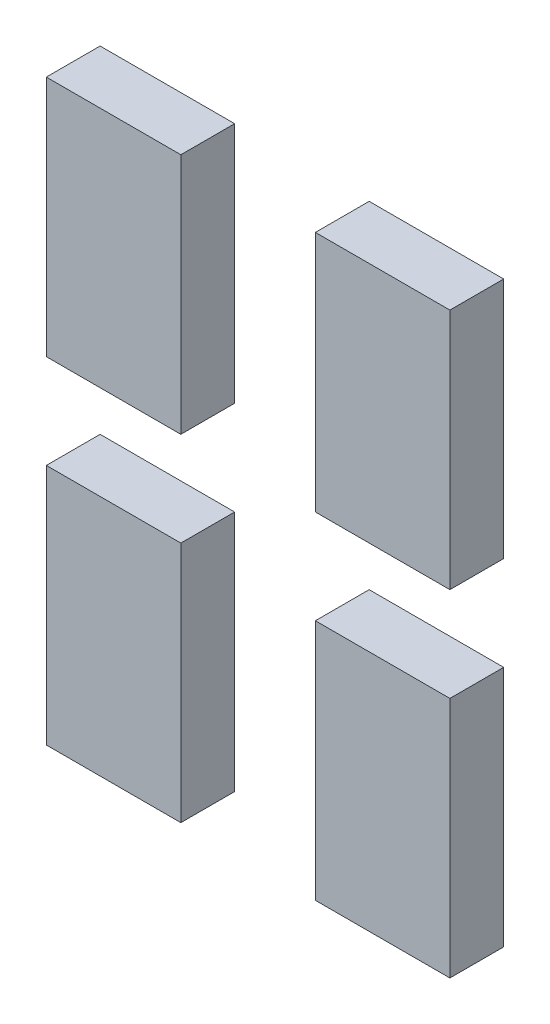
ISO-10303-21;
HEADER;
FILE_DESCRIPTION(('STEP AP214'),'2;1');
FILE_NAME('part.step','',(''),(''),'','','');
FILE_SCHEMA(('AUTOMOTIVE_DESIGN { 1 0 10303 214 1 1 1 1 }'));
ENDSEC;
DATA;
#1=APPLICATION_CONTEXT('core data for automotive mechanical design processes');
#2=APPLICATION_PROTOCOL_DEFINITION('international standard','automotive_design',2000,#1);
#3=PRODUCT_CONTEXT('',#1,'mechanical');
#4=PRODUCT('Part','Part','',(#3));
#5=PRODUCT_RELATED_PRODUCT_CATEGORY('part','',(#4));
#6=PRODUCT_DEFINITION_FORMATION('','',#4);
#7=PRODUCT_DEFINITION_CONTEXT('part definition',#1,'design');
#8=PRODUCT_DEFINITION('design','',#6,#7);
#9=PRODUCT_DEFINITION_SHAPE('','',#8);
#10=(LENGTH_UNIT() NAMED_UNIT(*) SI_UNIT(.MILLI.,.METRE.));
#11=(NAMED_UNIT(*) PLANE_ANGLE_UNIT() SI_UNIT($,.RADIAN.));
#12=(NAMED_UNIT(*) SI_UNIT($,.STERADIAN.) SOLID_ANGLE_UNIT());
#13=UNCERTAINTY_MEASURE_WITH_UNIT(LENGTH_MEASURE(1.E-05),#10,'distance_accuracy_value','');
#14=(GEOMETRIC_REPRESENTATION_CONTEXT(3) GLOBAL_UNCERTAINTY_ASSIGNED_CONTEXT((#13)) GLOBAL_UNIT_ASSIGNED_CONTEXT((#10,
#11,#12)) REPRESENTATION_CONTEXT('',''));
#15=CARTESIAN_POINT('',(0.,0.,0.));
#16=DIRECTION('',(0.,0.,1.));
#17=DIRECTION('',(1.,0.,0.));
#18=AXIS2_PLACEMENT_3D('',#15,#16,#17);
#19=CARTESIAN_POINT('',(-1.00000000000002,6.8,0.8));
#20=DIRECTION('',(0.,-1.,0.));
#21=DIRECTION('',(0.,0.,-1.));
#22=AXIS2_PLACEMENT_3D('',#19,#20,#21);
#23=PLANE('',#22);
#24=DIRECTION('',(-1.,0.,0.));
#25=VECTOR('',#24,1.);
#26=CARTESIAN_POINT('',(-1.00000000000002,6.8,0.));
#27=LINE('',#26,#25);
#28=CARTESIAN_POINT('',(0.999999999999983,6.8,0.));
#29=VERTEX_POINT('',#28);
#30=CARTESIAN_POINT('',(-1.00000000000002,6.8,0.));
#31=VERTEX_POINT('',#30);
#32=EDGE_CURVE('E110',#29,#31,#27,.T.);
#33=ORIENTED_EDGE('',*,*,#32,.T.);
#34=DIRECTION('',(0.,0.,-1.));
#35=VECTOR('',#34,1.);
#36=CARTESIAN_POINT('',(-1.00000000000002,6.8,0.8));
#37=LINE('',#36,#35);
#38=CARTESIAN_POINT('',(-1.00000000000002,6.8,0.8));
#39=VERTEX_POINT('',#38);
#40=EDGE_CURVE('E12',#39,#31,#37,.T.);
#41=ORIENTED_EDGE('',*,*,#40,.F.);
#42=DIRECTION('',(-1.,0.,0.));
#43=VECTOR('',#42,1.);
#44=CARTESIAN_POINT('',(-1.00000000000002,6.8,0.8));
#45=LINE('',#44,#43);
#46=CARTESIAN_POINT('',(0.999999999999983,6.8,0.8));
#47=VERTEX_POINT('',#46);
#48=EDGE_CURVE('E98',#47,#39,#45,.T.);
#49=ORIENTED_EDGE('',*,*,#48,.F.);
#50=DIRECTION('',(0.,0.,-1.));
#51=VECTOR('',#50,1.);
#52=CARTESIAN_POINT('',(0.999999999999983,6.8,0.8));
#53=LINE('',#52,#51);
#54=EDGE_CURVE('E106',#47,#29,#53,.T.);
#55=ORIENTED_EDGE('',*,*,#54,.T.);
#56=EDGE_LOOP('',(#33,#41,#49,#55));
#57=FACE_BOUND('',#56,.T.);
#58=ADVANCED_FACE('F47',(#57),#23,.F.);
#59=CARTESIAN_POINT('',(-1.00000000000002,3.2,0.8));
#60=DIRECTION('',(1.,0.,0.));
#61=DIRECTION('',(0.,0.,-1.));
#62=AXIS2_PLACEMENT_3D('',#59,#60,#61);
#63=PLANE('',#62);
#64=DIRECTION('',(0.,-1.,0.));
#65=VECTOR('',#64,1.);
#66=CARTESIAN_POINT('',(-1.00000000000002,3.2,0.));
#67=LINE('',#66,#65);
#68=CARTESIAN_POINT('',(-1.00000000000002,3.2,0.));
#69=VERTEX_POINT('',#68);
#70=EDGE_CURVE('E102',#31,#69,#67,.T.);
#71=ORIENTED_EDGE('',*,*,#70,.T.);
#72=DIRECTION('',(0.,0.,-1.));
#73=VECTOR('',#72,1.);
#74=CARTESIAN_POINT('',(-1.00000000000002,3.2,0.8));
#75=LINE('',#74,#73);
#76=CARTESIAN_POINT('',(-1.00000000000002,3.2,0.8));
#77=VERTEX_POINT('',#76);
#78=EDGE_CURVE('E55',#77,#69,#75,.T.);
#79=ORIENTED_EDGE('',*,*,#78,.F.);
#80=DIRECTION('',(0.,-1.,0.));
#81=VECTOR('',#80,1.);
#82=CARTESIAN_POINT('',(-1.00000000000002,3.2,0.8));
#83=LINE('',#82,#81);
#84=EDGE_CURVE('E93',#39,#77,#83,.T.);
#85=ORIENTED_EDGE('',*,*,#84,.F.);
#86=ORIENTED_EDGE('',*,*,#40,.T.);
#87=EDGE_LOOP('',(#71,#79,#85,#86));
#88=FACE_BOUND('',#87,.T.);
#89=ADVANCED_FACE('F101',(#88),#63,.F.);
#90=CARTESIAN_POINT('',(-1.00000000000002,3.2,0.8));
#91=DIRECTION('',(0.,1.,0.));
#92=DIRECTION('',(0.,0.,1.));
#93=AXIS2_PLACEMENT_3D('',#90,#91,#92);
#94=PLANE('',#93);
#95=DIRECTION('',(1.,0.,0.));
#96=VECTOR('',#95,1.);
#97=CARTESIAN_POINT('',(-1.00000000000002,3.2,0.));
#98=LINE('',#97,#96);
#99=CARTESIAN_POINT('',(0.999999999999983,3.2,0.));
#100=VERTEX_POINT('',#99);
#101=EDGE_CURVE('E80',#69,#100,#98,.T.);
#102=ORIENTED_EDGE('',*,*,#101,.T.);
#103=DIRECTION('',(0.,0.,-1.));
#104=VECTOR('',#103,1.);
#105=CARTESIAN_POINT('',(0.999999999999983,3.2,0.8));
#106=LINE('',#105,#104);
#107=CARTESIAN_POINT('',(0.999999999999983,3.2,0.8));
#108=VERTEX_POINT('',#107);
#109=EDGE_CURVE('E103',#108,#100,#106,.T.);
#110=ORIENTED_EDGE('',*,*,#109,.F.);
#111=DIRECTION('',(1.,0.,0.));
#112=VECTOR('',#111,1.);
#113=CARTESIAN_POINT('',(-1.00000000000002,3.2,0.8));
#114=LINE('',#113,#112);
#115=EDGE_CURVE('E96',#77,#108,#114,.T.);
#116=ORIENTED_EDGE('',*,*,#115,.F.);
#117=ORIENTED_EDGE('',*,*,#78,.T.);
#118=EDGE_LOOP('',(#102,#110,#116,#117));
#119=FACE_BOUND('',#118,.T.);
#120=ADVANCED_FACE('F104',(#119),#94,.F.);
#121=CARTESIAN_POINT('',(0.999999999999983,3.2,0.8));
#122=DIRECTION('',(-1.,0.,0.));
#123=DIRECTION('',(0.,0.,1.));
#124=AXIS2_PLACEMENT_3D('',#121,#122,#123);
#125=PLANE('',#124);
#126=DIRECTION('',(0.,1.,0.));
#127=VECTOR('',#126,1.);
#128=CARTESIAN_POINT('',(0.999999999999983,3.2,0.));
#129=LINE('',#128,#127);
#130=EDGE_CURVE('E86',#100,#29,#129,.T.);
#131=ORIENTED_EDGE('',*,*,#130,.T.);
#132=ORIENTED_EDGE('',*,*,#54,.F.);
#133=DIRECTION('',(0.,1.,0.));
#134=VECTOR('',#133,1.);
#135=CARTESIAN_POINT('',(0.999999999999983,3.2,0.8));
#136=LINE('',#135,#134);
#137=EDGE_CURVE('E63',#108,#47,#136,.T.);
#138=ORIENTED_EDGE('',*,*,#137,.F.);
#139=ORIENTED_EDGE('',*,*,#109,.T.);
#140=EDGE_LOOP('',(#131,#132,#138,#139));
#141=FACE_BOUND('',#140,.T.);
#142=ADVANCED_FACE('F117',(#141),#125,.F.);
#143=CARTESIAN_POINT('',(0.,0.,0.8));
#144=DIRECTION('',(0.,0.,1.));
#145=DIRECTION('',(1.,0.,0.));
#146=AXIS2_PLACEMENT_3D('',#143,#144,#145);
#147=PLANE('',#146);
#148=ORIENTED_EDGE('',*,*,#48,.T.);
#149=ORIENTED_EDGE('',*,*,#84,.T.);
#150=ORIENTED_EDGE('',*,*,#115,.T.);
#151=ORIENTED_EDGE('',*,*,#137,.T.);
#152=EDGE_LOOP('',(#148,#149,#150,#151));
#153=FACE_BOUND('',#152,.T.);
#154=ADVANCED_FACE('F94',(#153),#147,.T.);
#155=CARTESIAN_POINT('',(0.,0.,0.));
#156=DIRECTION('',(0.,0.,1.));
#157=DIRECTION('',(1.,0.,0.));
#158=AXIS2_PLACEMENT_3D('',#155,#156,#157);
#159=PLANE('',#158);
#160=ORIENTED_EDGE('',*,*,#32,.F.);
#161=ORIENTED_EDGE('',*,*,#130,.F.);
#162=ORIENTED_EDGE('',*,*,#101,.F.);
#163=ORIENTED_EDGE('',*,*,#70,.F.);
#164=EDGE_LOOP('',(#160,#161,#162,#163));
#165=FACE_BOUND('',#164,.T.);
#166=ADVANCED_FACE('F120',(#165),#159,.F.);
#167=CLOSED_SHELL('',(#58,#89,#120,#142,#154,#166));
#168=MANIFOLD_SOLID_BREP('B2',#167);
#169=CARTESIAN_POINT('',(2.99999999999998,6.8,0.8));
#170=DIRECTION('',(0.,-1.,0.));
#171=DIRECTION('',(0.,0.,-1.));
#172=AXIS2_PLACEMENT_3D('',#169,#170,#171);
#173=PLANE('',#172);
#174=DIRECTION('',(-1.,0.,0.));
#175=VECTOR('',#174,1.);
#176=CARTESIAN_POINT('',(2.99999999999998,6.8,0.));
#177=LINE('',#176,#175);
#178=CARTESIAN_POINT('',(4.99999999999998,6.8,0.));
#179=VERTEX_POINT('',#178);
#180=CARTESIAN_POINT('',(2.99999999999998,6.8,0.));
#181=VERTEX_POINT('',#180);
#182=EDGE_CURVE('E243',#179,#181,#177,.T.);
#183=ORIENTED_EDGE('',*,*,#182,.T.);
#184=DIRECTION('',(0.,0.,-1.));
#185=VECTOR('',#184,1.);
#186=CARTESIAN_POINT('',(2.99999999999998,6.8,0.8));
#187=LINE('',#186,#185);
#188=CARTESIAN_POINT('',(2.99999999999998,6.8,0.8));
#189=VERTEX_POINT('',#188);
#190=EDGE_CURVE('E45',#189,#181,#187,.T.);
#191=ORIENTED_EDGE('',*,*,#190,.F.);
#192=DIRECTION('',(-1.,0.,0.));
#193=VECTOR('',#192,1.);
#194=CARTESIAN_POINT('',(2.99999999999998,6.8,0.8));
#195=LINE('',#194,#193);
#196=CARTESIAN_POINT('',(4.99999999999998,6.8,0.8));
#197=VERTEX_POINT('',#196);
#198=EDGE_CURVE('E231',#197,#189,#195,.T.);
#199=ORIENTED_EDGE('',*,*,#198,.F.);
#200=DIRECTION('',(0.,0.,-1.));
#201=VECTOR('',#200,1.);
#202=CARTESIAN_POINT('',(4.99999999999998,6.8,0.8));
#203=LINE('',#202,#201);
#204=EDGE_CURVE('E239',#197,#179,#203,.T.);
#205=ORIENTED_EDGE('',*,*,#204,.T.);
#206=EDGE_LOOP('',(#183,#191,#199,#205));
#207=FACE_BOUND('',#206,.T.);
#208=ADVANCED_FACE('F180',(#207),#173,.F.);
#209=CARTESIAN_POINT('',(2.99999999999998,3.2,0.8));
#210=DIRECTION('',(1.,0.,0.));
#211=DIRECTION('',(0.,0.,-1.));
#212=AXIS2_PLACEMENT_3D('',#209,#210,#211);
#213=PLANE('',#212);
#214=DIRECTION('',(0.,-1.,0.));
#215=VECTOR('',#214,1.);
#216=CARTESIAN_POINT('',(2.99999999999998,3.2,0.));
#217=LINE('',#216,#215);
#218=CARTESIAN_POINT('',(2.99999999999998,3.2,0.));
#219=VERTEX_POINT('',#218);
#220=EDGE_CURVE('E235',#181,#219,#217,.T.);
#221=ORIENTED_EDGE('',*,*,#220,.T.);
#222=DIRECTION('',(0.,0.,-1.));
#223=VECTOR('',#222,1.);
#224=CARTESIAN_POINT('',(2.99999999999998,3.2,0.8));
#225=LINE('',#224,#223);
#226=CARTESIAN_POINT('',(2.99999999999998,3.2,0.8));
#227=VERTEX_POINT('',#226);
#228=EDGE_CURVE('E188',#227,#219,#225,.T.);
#229=ORIENTED_EDGE('',*,*,#228,.F.);
#230=DIRECTION('',(0.,-1.,0.));
#231=VECTOR('',#230,1.);
#232=CARTESIAN_POINT('',(2.99999999999998,3.2,0.8));
#233=LINE('',#232,#231);
#234=EDGE_CURVE('E226',#189,#227,#233,.T.);
#235=ORIENTED_EDGE('',*,*,#234,.F.);
#236=ORIENTED_EDGE('',*,*,#190,.T.);
#237=EDGE_LOOP('',(#221,#229,#235,#236));
#238=FACE_BOUND('',#237,.T.);
#239=ADVANCED_FACE('F234',(#238),#213,.F.);
#240=CARTESIAN_POINT('',(2.99999999999998,3.2,0.8));
#241=DIRECTION('',(0.,1.,0.));
#242=DIRECTION('',(0.,0.,1.));
#243=AXIS2_PLACEMENT_3D('',#240,#241,#242);
#244=PLANE('',#243);
#245=DIRECTION('',(1.,0.,0.));
#246=VECTOR('',#245,1.);
#247=CARTESIAN_POINT('',(2.99999999999998,3.2,0.));
#248=LINE('',#247,#246);
#249=CARTESIAN_POINT('',(4.99999999999998,3.2,0.));
#250=VERTEX_POINT('',#249);
#251=EDGE_CURVE('E213',#219,#250,#248,.T.);
#252=ORIENTED_EDGE('',*,*,#251,.T.);
#253=DIRECTION('',(0.,0.,-1.));
#254=VECTOR('',#253,1.);
#255=CARTESIAN_POINT('',(4.99999999999998,3.2,0.8));
#256=LINE('',#255,#254);
#257=CARTESIAN_POINT('',(4.99999999999998,3.2,0.8));
#258=VERTEX_POINT('',#257);
#259=EDGE_CURVE('E236',#258,#250,#256,.T.);
#260=ORIENTED_EDGE('',*,*,#259,.F.);
#261=DIRECTION('',(1.,0.,0.));
#262=VECTOR('',#261,1.);
#263=CARTESIAN_POINT('',(2.99999999999998,3.2,0.8));
#264=LINE('',#263,#262);
#265=EDGE_CURVE('E229',#227,#258,#264,.T.);
#266=ORIENTED_EDGE('',*,*,#265,.F.);
#267=ORIENTED_EDGE('',*,*,#228,.T.);
#268=EDGE_LOOP('',(#252,#260,#266,#267));
#269=FACE_BOUND('',#268,.T.);
#270=ADVANCED_FACE('F237',(#269),#244,.F.);
#271=CARTESIAN_POINT('',(4.99999999999998,3.2,0.8));
#272=DIRECTION('',(-1.,0.,0.));
#273=DIRECTION('',(0.,0.,1.));
#274=AXIS2_PLACEMENT_3D('',#271,#272,#273);
#275=PLANE('',#274);
#276=DIRECTION('',(0.,1.,0.));
#277=VECTOR('',#276,1.);
#278=CARTESIAN_POINT('',(4.99999999999998,3.2,0.));
#279=LINE('',#278,#277);
#280=EDGE_CURVE('E219',#250,#179,#279,.T.);
#281=ORIENTED_EDGE('',*,*,#280,.T.);
#282=ORIENTED_EDGE('',*,*,#204,.F.);
#283=DIRECTION('',(0.,1.,0.));
#284=VECTOR('',#283,1.);
#285=CARTESIAN_POINT('',(4.99999999999998,3.2,0.8));
#286=LINE('',#285,#284);
#287=EDGE_CURVE('E196',#258,#197,#286,.T.);
#288=ORIENTED_EDGE('',*,*,#287,.F.);
#289=ORIENTED_EDGE('',*,*,#259,.T.);
#290=EDGE_LOOP('',(#281,#282,#288,#289));
#291=FACE_BOUND('',#290,.T.);
#292=ADVANCED_FACE('F250',(#291),#275,.F.);
#293=CARTESIAN_POINT('',(0.,0.,0.8));
#294=DIRECTION('',(0.,0.,1.));
#295=DIRECTION('',(1.,0.,0.));
#296=AXIS2_PLACEMENT_3D('',#293,#294,#295);
#297=PLANE('',#296);
#298=ORIENTED_EDGE('',*,*,#198,.T.);
#299=ORIENTED_EDGE('',*,*,#234,.T.);
#300=ORIENTED_EDGE('',*,*,#265,.T.);
#301=ORIENTED_EDGE('',*,*,#287,.T.);
#302=EDGE_LOOP('',(#298,#299,#300,#301));
#303=FACE_BOUND('',#302,.T.);
#304=ADVANCED_FACE('F227',(#303),#297,.T.);
#305=CARTESIAN_POINT('',(0.,0.,0.));
#306=DIRECTION('',(0.,0.,1.));
#307=DIRECTION('',(1.,0.,0.));
#308=AXIS2_PLACEMENT_3D('',#305,#306,#307);
#309=PLANE('',#308);
#310=ORIENTED_EDGE('',*,*,#182,.F.);
#311=ORIENTED_EDGE('',*,*,#280,.F.);
#312=ORIENTED_EDGE('',*,*,#251,.F.);
#313=ORIENTED_EDGE('',*,*,#220,.F.);
#314=EDGE_LOOP('',(#310,#311,#312,#313));
#315=FACE_BOUND('',#314,.T.);
#316=ADVANCED_FACE('F253',(#315),#309,.F.);
#317=CLOSED_SHELL('',(#208,#239,#270,#292,#304,#316));
#318=MANIFOLD_SOLID_BREP('B6',#317);
#319=CARTESIAN_POINT('',(3.,1.8,0.8));
#320=DIRECTION('',(0.,-1.,0.));
#321=DIRECTION('',(0.,0.,-1.));
#322=AXIS2_PLACEMENT_3D('',#319,#320,#321);
#323=PLANE('',#322);
#324=DIRECTION('',(-1.,0.,0.));
#325=VECTOR('',#324,1.);
#326=CARTESIAN_POINT('',(3.,1.8,0.));
#327=LINE('',#326,#325);
#328=CARTESIAN_POINT('',(5.,1.8,0.));
#329=VERTEX_POINT('',#328);
#330=CARTESIAN_POINT('',(3.,1.8,0.));
#331=VERTEX_POINT('',#330);
#332=EDGE_CURVE('E375',#329,#331,#327,.T.);
#333=ORIENTED_EDGE('',*,*,#332,.T.);
#334=DIRECTION('',(0.,0.,-1.));
#335=VECTOR('',#334,1.);
#336=CARTESIAN_POINT('',(3.,1.8,0.8));
#337=LINE('',#336,#335);
#338=CARTESIAN_POINT('',(3.,1.8,0.8));
#339=VERTEX_POINT('',#338);
#340=EDGE_CURVE('E178',#339,#331,#337,.T.);
#341=ORIENTED_EDGE('',*,*,#340,.F.);
#342=DIRECTION('',(-1.,0.,0.));
#343=VECTOR('',#342,1.);
#344=CARTESIAN_POINT('',(3.,1.8,0.8));
#345=LINE('',#344,#343);
#346=CARTESIAN_POINT('',(5.,1.8,0.8));
#347=VERTEX_POINT('',#346);
#348=EDGE_CURVE('E363',#347,#339,#345,.T.);
#349=ORIENTED_EDGE('',*,*,#348,.F.);
#350=DIRECTION('',(0.,0.,-1.));
#351=VECTOR('',#350,1.);
#352=CARTESIAN_POINT('',(5.,1.8,0.8));
#353=LINE('',#352,#351);
#354=EDGE_CURVE('E371',#347,#329,#353,.T.);
#355=ORIENTED_EDGE('',*,*,#354,.T.);
#356=EDGE_LOOP('',(#333,#341,#349,#355));
#357=FACE_BOUND('',#356,.T.);
#358=ADVANCED_FACE('F312',(#357),#323,.F.);
#359=CARTESIAN_POINT('',(3.,-1.8,0.8));
#360=DIRECTION('',(1.,0.,0.));
#361=DIRECTION('',(0.,0.,-1.));
#362=AXIS2_PLACEMENT_3D('',#359,#360,#361);
#363=PLANE('',#362);
#364=DIRECTION('',(0.,-1.,0.));
#365=VECTOR('',#364,1.);
#366=CARTESIAN_POINT('',(3.,-1.8,0.));
#367=LINE('',#366,#365);
#368=CARTESIAN_POINT('',(3.,-1.8,0.));
#369=VERTEX_POINT('',#368);
#370=EDGE_CURVE('E367',#331,#369,#367,.T.);
#371=ORIENTED_EDGE('',*,*,#370,.T.);
#372=DIRECTION('',(0.,0.,-1.));
#373=VECTOR('',#372,1.);
#374=CARTESIAN_POINT('',(3.,-1.8,0.8));
#375=LINE('',#374,#373);
#376=CARTESIAN_POINT('',(3.,-1.8,0.8));
#377=VERTEX_POINT('',#376);
#378=EDGE_CURVE('E320',#377,#369,#375,.T.);
#379=ORIENTED_EDGE('',*,*,#378,.F.);
#380=DIRECTION('',(0.,-1.,0.));
#381=VECTOR('',#380,1.);
#382=CARTESIAN_POINT('',(3.,-1.8,0.8));
#383=LINE('',#382,#381);
#384=EDGE_CURVE('E358',#339,#377,#383,.T.);
#385=ORIENTED_EDGE('',*,*,#384,.F.);
#386=ORIENTED_EDGE('',*,*,#340,.T.);
#387=EDGE_LOOP('',(#371,#379,#385,#386));
#388=FACE_BOUND('',#387,.T.);
#389=ADVANCED_FACE('F366',(#388),#363,.F.);
#390=CARTESIAN_POINT('',(3.,-1.8,0.8));
#391=DIRECTION('',(0.,1.,0.));
#392=DIRECTION('',(0.,0.,1.));
#393=AXIS2_PLACEMENT_3D('',#390,#391,#392);
#394=PLANE('',#393);
#395=DIRECTION('',(1.,0.,0.));
#396=VECTOR('',#395,1.);
#397=CARTESIAN_POINT('',(3.,-1.8,0.));
#398=LINE('',#397,#396);
#399=CARTESIAN_POINT('',(5.,-1.8,0.));
#400=VERTEX_POINT('',#399);
#401=EDGE_CURVE('E345',#369,#400,#398,.T.);
#402=ORIENTED_EDGE('',*,*,#401,.T.);
#403=DIRECTION('',(0.,0.,-1.));
#404=VECTOR('',#403,1.);
#405=CARTESIAN_POINT('',(5.,-1.8,0.8));
#406=LINE('',#405,#404);
#407=CARTESIAN_POINT('',(5.,-1.8,0.8));
#408=VERTEX_POINT('',#407);
#409=EDGE_CURVE('E368',#408,#400,#406,.T.);
#410=ORIENTED_EDGE('',*,*,#409,.F.);
#411=DIRECTION('',(1.,0.,0.));
#412=VECTOR('',#411,1.);
#413=CARTESIAN_POINT('',(3.,-1.8,0.8));
#414=LINE('',#413,#412);
#415=EDGE_CURVE('E361',#377,#408,#414,.T.);
#416=ORIENTED_EDGE('',*,*,#415,.F.);
#417=ORIENTED_EDGE('',*,*,#378,.T.);
#418=EDGE_LOOP('',(#402,#410,#416,#417));
#419=FACE_BOUND('',#418,.T.);
#420=ADVANCED_FACE('F369',(#419),#394,.F.);
#421=CARTESIAN_POINT('',(5.,-1.8,0.8));
#422=DIRECTION('',(-1.,0.,0.));
#423=DIRECTION('',(0.,0.,1.));
#424=AXIS2_PLACEMENT_3D('',#421,#422,#423);
#425=PLANE('',#424);
#426=DIRECTION('',(0.,1.,0.));
#427=VECTOR('',#426,1.);
#428=CARTESIAN_POINT('',(5.,-1.8,0.));
#429=LINE('',#428,#427);
#430=EDGE_CURVE('E351',#400,#329,#429,.T.);
#431=ORIENTED_EDGE('',*,*,#430,.T.);
#432=ORIENTED_EDGE('',*,*,#354,.F.);
#433=DIRECTION('',(0.,1.,0.));
#434=VECTOR('',#433,1.);
#435=CARTESIAN_POINT('',(5.,-1.8,0.8));
#436=LINE('',#435,#434);
#437=EDGE_CURVE('E328',#408,#347,#436,.T.);
#438=ORIENTED_EDGE('',*,*,#437,.F.);
#439=ORIENTED_EDGE('',*,*,#409,.T.);
#440=EDGE_LOOP('',(#431,#432,#438,#439));
#441=FACE_BOUND('',#440,.T.);
#442=ADVANCED_FACE('F382',(#441),#425,.F.);
#443=CARTESIAN_POINT('',(0.,0.,0.8));
#444=DIRECTION('',(0.,0.,1.));
#445=DIRECTION('',(1.,0.,0.));
#446=AXIS2_PLACEMENT_3D('',#443,#444,#445);
#447=PLANE('',#446);
#448=ORIENTED_EDGE('',*,*,#348,.T.);
#449=ORIENTED_EDGE('',*,*,#384,.T.);
#450=ORIENTED_EDGE('',*,*,#415,.T.);
#451=ORIENTED_EDGE('',*,*,#437,.T.);
#452=EDGE_LOOP('',(#448,#449,#450,#451));
#453=FACE_BOUND('',#452,.T.);
#454=ADVANCED_FACE('F359',(#453),#447,.T.);
#455=CARTESIAN_POINT('',(0.,0.,0.));
#456=DIRECTION('',(0.,0.,1.));
#457=DIRECTION('',(1.,0.,0.));
#458=AXIS2_PLACEMENT_3D('',#455,#456,#457);
#459=PLANE('',#458);
#460=ORIENTED_EDGE('',*,*,#332,.F.);
#461=ORIENTED_EDGE('',*,*,#430,.F.);
#462=ORIENTED_EDGE('',*,*,#401,.F.);
#463=ORIENTED_EDGE('',*,*,#370,.F.);
#464=EDGE_LOOP('',(#460,#461,#462,#463));
#465=FACE_BOUND('',#464,.T.);
#466=ADVANCED_FACE('F385',(#465),#459,.F.);
#467=CLOSED_SHELL('',(#358,#389,#420,#442,#454,#466));
#468=MANIFOLD_SOLID_BREP('B39',#467);
#469=CARTESIAN_POINT('',(1.,-1.8,0.8));
#470=DIRECTION('',(-1.,0.,0.));
#471=DIRECTION('',(0.,0.,1.));
#472=AXIS2_PLACEMENT_3D('',#469,#470,#471);
#473=PLANE('',#472);
#474=DIRECTION('',(0.,1.,0.));
#475=VECTOR('',#474,1.);
#476=CARTESIAN_POINT('',(1.,-1.8,0.));
#477=LINE('',#476,#475);
#478=CARTESIAN_POINT('',(1.,-1.8,0.));
#479=VERTEX_POINT('',#478);
#480=CARTESIAN_POINT('',(1.,1.8,0.));
#481=VERTEX_POINT('',#480);
#482=EDGE_CURVE('E498',#479,#481,#477,.T.);
#483=ORIENTED_EDGE('',*,*,#482,.T.);
#484=DIRECTION('',(0.,0.,-1.));
#485=VECTOR('',#484,1.);
#486=CARTESIAN_POINT('',(1.,1.8,0.8));
#487=LINE('',#486,#485);
#488=CARTESIAN_POINT('',(1.,1.8,0.8));
#489=VERTEX_POINT('',#488);
#490=EDGE_CURVE('E310',#489,#481,#487,.T.);
#491=ORIENTED_EDGE('',*,*,#490,.F.);
#492=DIRECTION('',(0.,1.,0.));
#493=VECTOR('',#492,1.);
#494=CARTESIAN_POINT('',(1.,-1.8,0.8));
#495=LINE('',#494,#493);
#496=CARTESIAN_POINT('',(1.,-1.8,0.8));
#497=VERTEX_POINT('',#496);
#498=EDGE_CURVE('E486',#497,#489,#495,.T.);
#499=ORIENTED_EDGE('',*,*,#498,.F.);
#500=DIRECTION('',(0.,0.,-1.));
#501=VECTOR('',#500,1.);
#502=CARTESIAN_POINT('',(1.,-1.8,0.8));
#503=LINE('',#502,#501);
#504=EDGE_CURVE('E494',#497,#479,#503,.T.);
#505=ORIENTED_EDGE('',*,*,#504,.T.);
#506=EDGE_LOOP('',(#483,#491,#499,#505));
#507=FACE_BOUND('',#506,.T.);
#508=ADVANCED_FACE('F435',(#507),#473,.F.);
#509=CARTESIAN_POINT('',(-1.,1.8,0.8));
#510=DIRECTION('',(0.,-1.,0.));
#511=DIRECTION('',(0.,0.,-1.));
#512=AXIS2_PLACEMENT_3D('',#509,#510,#511);
#513=PLANE('',#512);
#514=DIRECTION('',(-1.,0.,0.));
#515=VECTOR('',#514,1.);
#516=CARTESIAN_POINT('',(-1.,1.8,0.));
#517=LINE('',#516,#515);
#518=CARTESIAN_POINT('',(-1.,1.8,0.));
#519=VERTEX_POINT('',#518);
#520=EDGE_CURVE('E490',#481,#519,#517,.T.);
#521=ORIENTED_EDGE('',*,*,#520,.T.);
#522=DIRECTION('',(0.,0.,-1.));
#523=VECTOR('',#522,1.);
#524=CARTESIAN_POINT('',(-1.,1.8,0.8));
#525=LINE('',#524,#523);
#526=CARTESIAN_POINT('',(-1.,1.8,0.8));
#527=VERTEX_POINT('',#526);
#528=EDGE_CURVE('E443',#527,#519,#525,.T.);
#529=ORIENTED_EDGE('',*,*,#528,.F.);
#530=DIRECTION('',(-1.,0.,0.));
#531=VECTOR('',#530,1.);
#532=CARTESIAN_POINT('',(-1.,1.8,0.8));
#533=LINE('',#532,#531);
#534=EDGE_CURVE('E481',#489,#527,#533,.T.);
#535=ORIENTED_EDGE('',*,*,#534,.F.);
#536=ORIENTED_EDGE('',*,*,#490,.T.);
#537=EDGE_LOOP('',(#521,#529,#535,#536));
#538=FACE_BOUND('',#537,.T.);
#539=ADVANCED_FACE('F489',(#538),#513,.F.);
#540=CARTESIAN_POINT('',(-1.,-1.8,0.8));
#541=DIRECTION('',(1.,0.,0.));
#542=DIRECTION('',(0.,0.,-1.));
#543=AXIS2_PLACEMENT_3D('',#540,#541,#542);
#544=PLANE('',#543);
#545=DIRECTION('',(0.,-1.,0.));
#546=VECTOR('',#545,1.);
#547=CARTESIAN_POINT('',(-1.,-1.8,0.));
#548=LINE('',#547,#546);
#549=CARTESIAN_POINT('',(-1.,-1.8,0.));
#550=VERTEX_POINT('',#549);
#551=EDGE_CURVE('E468',#519,#550,#548,.T.);
#552=ORIENTED_EDGE('',*,*,#551,.T.);
#553=DIRECTION('',(0.,0.,-1.));
#554=VECTOR('',#553,1.);
#555=CARTESIAN_POINT('',(-1.,-1.8,0.8));
#556=LINE('',#555,#554);
#557=CARTESIAN_POINT('',(-1.,-1.8,0.8));
#558=VERTEX_POINT('',#557);
#559=EDGE_CURVE('E491',#558,#550,#556,.T.);
#560=ORIENTED_EDGE('',*,*,#559,.F.);
#561=DIRECTION('',(0.,-1.,0.));
#562=VECTOR('',#561,1.);
#563=CARTESIAN_POINT('',(-1.,-1.8,0.8));
#564=LINE('',#563,#562);
#565=EDGE_CURVE('E484',#527,#558,#564,.T.);
#566=ORIENTED_EDGE('',*,*,#565,.F.);
#567=ORIENTED_EDGE('',*,*,#528,.T.);
#568=EDGE_LOOP('',(#552,#560,#566,#567));
#569=FACE_BOUND('',#568,.T.);
#570=ADVANCED_FACE('F492',(#569),#544,.F.);
#571=CARTESIAN_POINT('',(-1.,-1.8,0.8));
#572=DIRECTION('',(0.,1.,0.));
#573=DIRECTION('',(0.,0.,1.));
#574=AXIS2_PLACEMENT_3D('',#571,#572,#573);
#575=PLANE('',#574);
#576=DIRECTION('',(1.,0.,0.));
#577=VECTOR('',#576,1.);
#578=CARTESIAN_POINT('',(-1.,-1.8,0.));
#579=LINE('',#578,#577);
#580=EDGE_CURVE('E474',#550,#479,#579,.T.);
#581=ORIENTED_EDGE('',*,*,#580,.T.);
#582=ORIENTED_EDGE('',*,*,#504,.F.);
#583=DIRECTION('',(1.,0.,0.));
#584=VECTOR('',#583,1.);
#585=CARTESIAN_POINT('',(-1.,-1.8,0.8));
#586=LINE('',#585,#584);
#587=EDGE_CURVE('E451',#558,#497,#586,.T.);
#588=ORIENTED_EDGE('',*,*,#587,.F.);
#589=ORIENTED_EDGE('',*,*,#559,.T.);
#590=EDGE_LOOP('',(#581,#582,#588,#589));
#591=FACE_BOUND('',#590,.T.);
#592=ADVANCED_FACE('F505',(#591),#575,.F.);
#593=CARTESIAN_POINT('',(0.,0.,0.8));
#594=DIRECTION('',(0.,0.,-1.));
#595=DIRECTION('',(-1.,0.,0.));
#596=AXIS2_PLACEMENT_3D('',#593,#594,#595);
#597=PLANE('',#596);
#598=ORIENTED_EDGE('',*,*,#498,.T.);
#599=ORIENTED_EDGE('',*,*,#534,.T.);
#600=ORIENTED_EDGE('',*,*,#565,.T.);
#601=ORIENTED_EDGE('',*,*,#587,.T.);
#602=EDGE_LOOP('',(#598,#599,#600,#601));
#603=FACE_BOUND('',#602,.T.);
#604=ADVANCED_FACE('F482',(#603),#597,.F.);
#605=CARTESIAN_POINT('',(0.,0.,0.));
#606=DIRECTION('',(0.,0.,-1.));
#607=DIRECTION('',(-1.,0.,0.));
#608=AXIS2_PLACEMENT_3D('',#605,#606,#607);
#609=PLANE('',#608);
#610=ORIENTED_EDGE('',*,*,#482,.F.);
#611=ORIENTED_EDGE('',*,*,#580,.F.);
#612=ORIENTED_EDGE('',*,*,#551,.F.);
#613=ORIENTED_EDGE('',*,*,#520,.F.);
#614=EDGE_LOOP('',(#610,#611,#612,#613));
#615=FACE_BOUND('',#614,.T.);
#616=ADVANCED_FACE('F508',(#615),#609,.T.);
#617=CLOSED_SHELL('',(#508,#539,#570,#592,#604,#616));
#618=MANIFOLD_SOLID_BREP('B172',#617);
#619=ADVANCED_BREP_SHAPE_REPRESENTATION('',(#18,#168,#318,#468,#618),#14);
#620=SHAPE_DEFINITION_REPRESENTATION(#9,#619);
ENDSEC;
END-ISO-10303-21;
